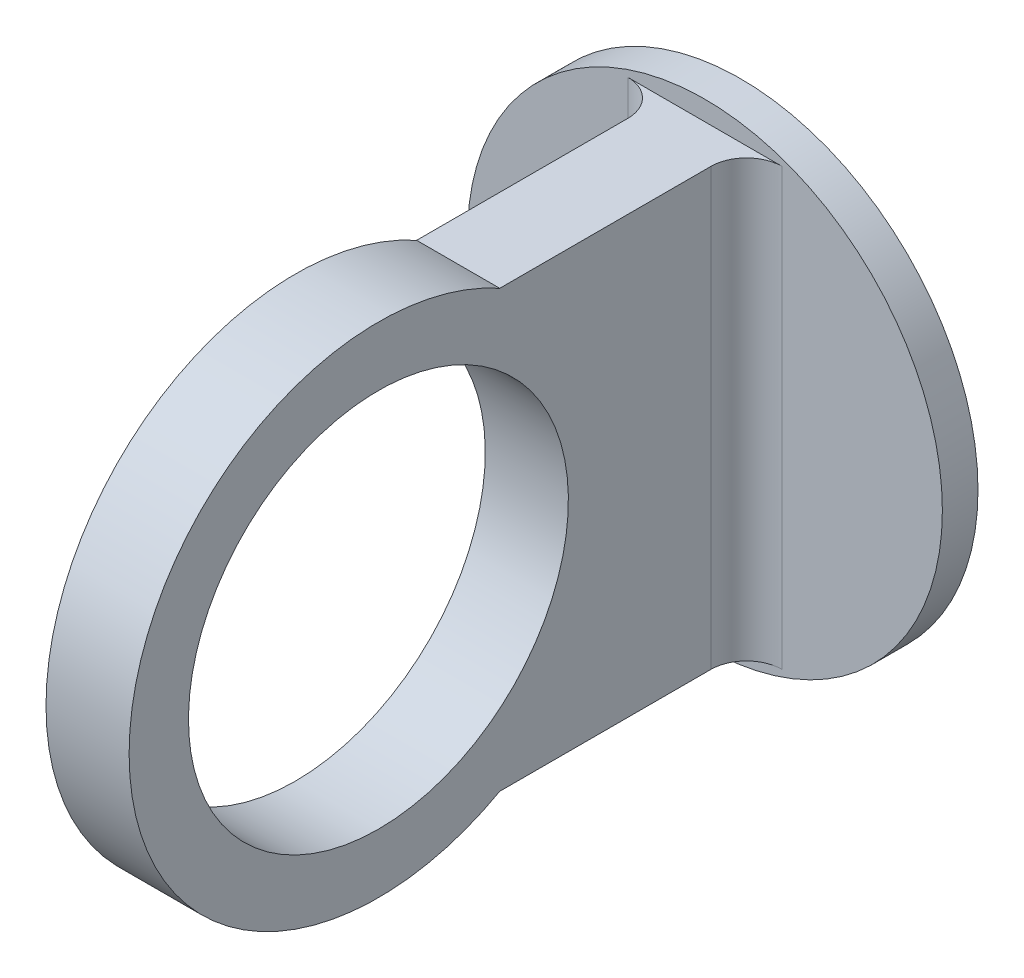
ISO-10303-21;
HEADER;
FILE_DESCRIPTION(('STEP AP214'),'2;1');
FILE_NAME('part.step','',(''),(''),'','','');
FILE_SCHEMA(('AUTOMOTIVE_DESIGN { 1 0 10303 214 1 1 1 1 }'));
ENDSEC;
DATA;
#1=APPLICATION_CONTEXT('core data for automotive mechanical design processes');
#2=APPLICATION_PROTOCOL_DEFINITION('international standard','automotive_design',2000,#1);
#3=PRODUCT_CONTEXT('',#1,'mechanical');
#4=PRODUCT('Part','Part','',(#3));
#5=PRODUCT_RELATED_PRODUCT_CATEGORY('part','',(#4));
#6=PRODUCT_DEFINITION_FORMATION('','',#4);
#7=PRODUCT_DEFINITION_CONTEXT('part definition',#1,'design');
#8=PRODUCT_DEFINITION('design','',#6,#7);
#9=PRODUCT_DEFINITION_SHAPE('','',#8);
#10=(LENGTH_UNIT() NAMED_UNIT(*) SI_UNIT(.MILLI.,.METRE.));
#11=(NAMED_UNIT(*) PLANE_ANGLE_UNIT() SI_UNIT($,.RADIAN.));
#12=(NAMED_UNIT(*) SI_UNIT($,.STERADIAN.) SOLID_ANGLE_UNIT());
#13=UNCERTAINTY_MEASURE_WITH_UNIT(LENGTH_MEASURE(1.E-05),#10,'distance_accuracy_value','');
#14=(GEOMETRIC_REPRESENTATION_CONTEXT(3) GLOBAL_UNCERTAINTY_ASSIGNED_CONTEXT((#13)) GLOBAL_UNIT_ASSIGNED_CONTEXT((#10,
#11,#12)) REPRESENTATION_CONTEXT('',''));
#15=CARTESIAN_POINT('',(0.,0.,0.));
#16=DIRECTION('',(0.,0.,1.));
#17=DIRECTION('',(1.,0.,0.));
#18=AXIS2_PLACEMENT_3D('',#15,#16,#17);
#19=CARTESIAN_POINT('',(0.,0.,3.));
#20=DIRECTION('',(0.,0.,-1.));
#21=DIRECTION('',(-1.,0.,0.));
#22=AXIS2_PLACEMENT_3D('',#19,#20,#21);
#23=CYLINDRICAL_SURFACE('',#22,20.);
#24=CARTESIAN_POINT('',(0.,0.,3.));
#25=DIRECTION('',(0.,0.,1.));
#26=DIRECTION('',(1.,0.,0.));
#27=AXIS2_PLACEMENT_3D('',#24,#25,#26);
#28=CIRCLE('',#27,20.);
#29=CARTESIAN_POINT('',(20.,0.,3.));
#30=VERTEX_POINT('',#29);
#31=EDGE_CURVE('E119',#30,#30,#28,.T.);
#32=ORIENTED_EDGE('',*,*,#31,.F.);
#33=EDGE_LOOP('',(#32));
#34=FACE_BOUND('',#33,.T.);
#35=CARTESIAN_POINT('',(0.,0.,0.));
#36=DIRECTION('',(0.,0.,1.));
#37=DIRECTION('',(1.,0.,0.));
#38=AXIS2_PLACEMENT_3D('',#35,#36,#37);
#39=CIRCLE('',#38,20.);
#40=CARTESIAN_POINT('',(20.,0.,0.));
#41=VERTEX_POINT('',#40);
#42=EDGE_CURVE('E127',#41,#41,#39,.T.);
#43=ORIENTED_EDGE('',*,*,#42,.T.);
#44=EDGE_LOOP('',(#43));
#45=FACE_BOUND('',#44,.T.);
#46=ADVANCED_FACE('F39',(#34,#45),#23,.T.);
#47=CARTESIAN_POINT('',(0.,0.,3.));
#48=DIRECTION('',(0.,0.,1.));
#49=DIRECTION('',(1.,0.,0.));
#50=AXIS2_PLACEMENT_3D('',#47,#48,#49);
#51=PLANE('',#50);
#52=DIRECTION('',(1.,0.,0.));
#53=VECTOR('',#52,1.);
#54=CARTESIAN_POINT('',(0.,-18.3466405357693,3.));
#55=LINE('',#54,#53);
#56=CARTESIAN_POINT('',(-6.5,-18.3466405357693,3.));
#57=VERTEX_POINT('',#56);
#58=CARTESIAN_POINT('',(6.5,-18.3466405357693,3.));
#59=VERTEX_POINT('',#58);
#60=EDGE_CURVE('E144',#57,#59,#55,.T.);
#61=ORIENTED_EDGE('',*,*,#60,.F.);
#62=DIRECTION('',(0.,-1.,0.));
#63=VECTOR('',#62,1.);
#64=CARTESIAN_POINT('',(-6.5,18.3466405357693,3.));
#65=LINE('',#64,#63);
#66=CARTESIAN_POINT('',(-6.5,18.3466405357693,3.));
#67=VERTEX_POINT('',#66);
#68=EDGE_CURVE('E124',#57,#67,#65,.F.);
#69=ORIENTED_EDGE('',*,*,#68,.T.);
#70=DIRECTION('',(-1.,0.,0.));
#71=VECTOR('',#70,1.);
#72=CARTESIAN_POINT('',(0.,18.3466405357693,3.));
#73=LINE('',#72,#71);
#74=CARTESIAN_POINT('',(6.5,18.3466405357693,3.));
#75=VERTEX_POINT('',#74);
#76=EDGE_CURVE('E106',#75,#67,#73,.T.);
#77=ORIENTED_EDGE('',*,*,#76,.F.);
#78=DIRECTION('',(0.,1.,0.));
#79=VECTOR('',#78,1.);
#80=CARTESIAN_POINT('',(6.5,-18.3466405357693,3.));
#81=LINE('',#80,#79);
#82=EDGE_CURVE('E118',#75,#59,#81,.F.);
#83=ORIENTED_EDGE('',*,*,#82,.T.);
#84=EDGE_LOOP('',(#61,#69,#77,#83));
#85=FACE_BOUND('',#84,.T.);
#86=ORIENTED_EDGE('',*,*,#31,.T.);
#87=EDGE_LOOP('',(#86));
#88=FACE_BOUND('',#87,.T.);
#89=ADVANCED_FACE('F173',(#85,#88),#51,.T.);
#90=CARTESIAN_POINT('',(0.,0.,0.));
#91=DIRECTION('',(0.,0.,1.));
#92=DIRECTION('',(1.,0.,0.));
#93=AXIS2_PLACEMENT_3D('',#90,#91,#92);
#94=PLANE('',#93);
#95=ORIENTED_EDGE('',*,*,#42,.F.);
#96=EDGE_LOOP('',(#95));
#97=FACE_BOUND('',#96,.T.);
#98=ADVANCED_FACE('F171',(#97),#94,.F.);
#99=CARTESIAN_POINT('',(-3.5,18.3466405357693,30.));
#100=DIRECTION('',(-1.,0.,0.));
#101=DIRECTION('',(0.,-1.,0.));
#102=AXIS2_PLACEMENT_3D('',#99,#100,#101);
#103=PLANE('',#102);
#104=CARTESIAN_POINT('',(-3.5,0.,34.));
#105=DIRECTION('',(-1.,0.,0.));
#106=DIRECTION('',(0.,-1.,0.));
#107=AXIS2_PLACEMENT_3D('',#104,#105,#106);
#108=CIRCLE('',#107,16.);
#109=CARTESIAN_POINT('',(-3.5,-16.,34.));
#110=VERTEX_POINT('',#109);
#111=EDGE_CURVE('E215',#110,#110,#108,.T.);
#112=ORIENTED_EDGE('',*,*,#111,.F.);
#113=EDGE_LOOP('',(#112));
#114=FACE_BOUND('',#113,.T.);
#115=DIRECTION('',(0.,0.,-1.));
#116=VECTOR('',#115,1.);
#117=CARTESIAN_POINT('',(-3.5,-18.3466405357693,30.));
#118=LINE('',#117,#116);
#119=CARTESIAN_POINT('',(-3.5,-18.3466405357693,23.7823299597577));
#120=VERTEX_POINT('',#119);
#121=CARTESIAN_POINT('',(-3.5,-18.3466405357693,6.));
#122=VERTEX_POINT('',#121);
#123=EDGE_CURVE('E155',#120,#122,#118,.T.);
#124=ORIENTED_EDGE('',*,*,#123,.F.);
#125=CARTESIAN_POINT('',(-3.5,0.,34.));
#126=DIRECTION('',(-1.,0.,0.));
#127=DIRECTION('',(0.,-1.,0.));
#128=AXIS2_PLACEMENT_3D('',#125,#126,#127);
#129=CIRCLE('',#128,21.);
#130=CARTESIAN_POINT('',(-3.5,18.3466405357693,23.7823299597577));
#131=VERTEX_POINT('',#130);
#132=EDGE_CURVE('E97',#120,#131,#129,.T.);
#133=ORIENTED_EDGE('',*,*,#132,.T.);
#134=DIRECTION('',(0.,0.,-1.));
#135=VECTOR('',#134,1.);
#136=CARTESIAN_POINT('',(-3.5,18.3466405357693,30.));
#137=LINE('',#136,#135);
#138=CARTESIAN_POINT('',(-3.5,18.3466405357693,6.));
#139=VERTEX_POINT('',#138);
#140=EDGE_CURVE('E91',#131,#139,#137,.T.);
#141=ORIENTED_EDGE('',*,*,#140,.T.);
#142=DIRECTION('',(0.,-1.,0.));
#143=VECTOR('',#142,1.);
#144=CARTESIAN_POINT('',(-3.5,-18.3466405357693,6.));
#145=LINE('',#144,#143);
#146=EDGE_CURVE('E95',#139,#122,#145,.T.);
#147=ORIENTED_EDGE('',*,*,#146,.T.);
#148=EDGE_LOOP('',(#124,#133,#141,#147));
#149=FACE_BOUND('',#148,.T.);
#150=ADVANCED_FACE('F93',(#114,#149),#103,.T.);
#151=CARTESIAN_POINT('',(3.5,-18.3466405357693,30.));
#152=DIRECTION('',(0.,-1.,0.));
#153=DIRECTION('',(0.,0.,-1.));
#154=AXIS2_PLACEMENT_3D('',#151,#152,#153);
#155=PLANE('',#154);
#156=DIRECTION('',(-1.,0.,0.));
#157=VECTOR('',#156,1.);
#158=CARTESIAN_POINT('',(3.5,-18.3466405357693,23.7823299597577));
#159=LINE('',#158,#157);
#160=CARTESIAN_POINT('',(3.5,-18.3466405357693,23.7823299597577));
#161=VERTEX_POINT('',#160);
#162=EDGE_CURVE('E55',#120,#161,#159,.F.);
#163=ORIENTED_EDGE('',*,*,#162,.F.);
#164=ORIENTED_EDGE('',*,*,#123,.T.);
#165=CARTESIAN_POINT('',(-6.5,-18.3466405357693,6.));
#166=DIRECTION('',(0.,-1.,0.));
#167=DIRECTION('',(0.,0.,-1.));
#168=AXIS2_PLACEMENT_3D('',#165,#166,#167);
#169=CIRCLE('',#168,3.);
#170=EDGE_CURVE('E112',#122,#57,#169,.F.);
#171=ORIENTED_EDGE('',*,*,#170,.T.);
#172=ORIENTED_EDGE('',*,*,#60,.T.);
#173=CARTESIAN_POINT('',(6.5,-18.3466405357693,6.));
#174=DIRECTION('',(0.,-1.,0.));
#175=DIRECTION('',(0.,0.,-1.));
#176=AXIS2_PLACEMENT_3D('',#173,#174,#175);
#177=CIRCLE('',#176,3.);
#178=CARTESIAN_POINT('',(3.5,-18.3466405357693,6.));
#179=VERTEX_POINT('',#178);
#180=EDGE_CURVE('E48',#59,#179,#177,.F.);
#181=ORIENTED_EDGE('',*,*,#180,.T.);
#182=DIRECTION('',(0.,0.,-1.));
#183=VECTOR('',#182,1.);
#184=CARTESIAN_POINT('',(3.5,-18.3466405357693,30.));
#185=LINE('',#184,#183);
#186=EDGE_CURVE('E60',#161,#179,#185,.T.);
#187=ORIENTED_EDGE('',*,*,#186,.F.);
#188=EDGE_LOOP('',(#163,#164,#171,#172,#181,#187));
#189=FACE_BOUND('',#188,.T.);
#190=ADVANCED_FACE('F143',(#189),#155,.T.);
#191=CARTESIAN_POINT('',(3.5,18.3466405357693,30.));
#192=DIRECTION('',(1.,0.,0.));
#193=DIRECTION('',(0.,1.,0.));
#194=AXIS2_PLACEMENT_3D('',#191,#192,#193);
#195=PLANE('',#194);
#196=CARTESIAN_POINT('',(3.5,0.,34.));
#197=DIRECTION('',(-1.,0.,0.));
#198=DIRECTION('',(0.,-1.,0.));
#199=AXIS2_PLACEMENT_3D('',#196,#197,#198);
#200=CIRCLE('',#199,16.);
#201=CARTESIAN_POINT('',(3.5,-16.,34.));
#202=VERTEX_POINT('',#201);
#203=EDGE_CURVE('E218',#202,#202,#200,.T.);
#204=ORIENTED_EDGE('',*,*,#203,.T.);
#205=EDGE_LOOP('',(#204));
#206=FACE_BOUND('',#205,.T.);
#207=CARTESIAN_POINT('',(3.5,0.,34.));
#208=DIRECTION('',(-1.,0.,0.));
#209=DIRECTION('',(0.,-1.,0.));
#210=AXIS2_PLACEMENT_3D('',#207,#208,#209);
#211=CIRCLE('',#210,21.);
#212=CARTESIAN_POINT('',(3.5,18.3466405357693,23.7823299597577));
#213=VERTEX_POINT('',#212);
#214=EDGE_CURVE('E153',#161,#213,#211,.T.);
#215=ORIENTED_EDGE('',*,*,#214,.F.);
#216=ORIENTED_EDGE('',*,*,#186,.T.);
#217=DIRECTION('',(0.,1.,0.));
#218=VECTOR('',#217,1.);
#219=CARTESIAN_POINT('',(3.5,18.3466405357693,6.));
#220=LINE('',#219,#218);
#221=CARTESIAN_POINT('',(3.5,18.3466405357693,6.));
#222=VERTEX_POINT('',#221);
#223=EDGE_CURVE('E133',#179,#222,#220,.T.);
#224=ORIENTED_EDGE('',*,*,#223,.T.);
#225=DIRECTION('',(0.,0.,-1.));
#226=VECTOR('',#225,1.);
#227=CARTESIAN_POINT('',(3.5,18.3466405357693,30.));
#228=LINE('',#227,#226);
#229=EDGE_CURVE('E100',#213,#222,#228,.T.);
#230=ORIENTED_EDGE('',*,*,#229,.F.);
#231=EDGE_LOOP('',(#215,#216,#224,#230));
#232=FACE_BOUND('',#231,.T.);
#233=ADVANCED_FACE('F151',(#206,#232),#195,.T.);
#234=CARTESIAN_POINT('',(3.5,18.3466405357693,30.));
#235=DIRECTION('',(0.,1.,0.));
#236=DIRECTION('',(0.,0.,1.));
#237=AXIS2_PLACEMENT_3D('',#234,#235,#236);
#238=PLANE('',#237);
#239=DIRECTION('',(-1.,0.,0.));
#240=VECTOR('',#239,1.);
#241=CARTESIAN_POINT('',(3.5,18.3466405357693,23.7823299597577));
#242=LINE('',#241,#240);
#243=EDGE_CURVE('E11',#213,#131,#242,.T.);
#244=ORIENTED_EDGE('',*,*,#243,.F.);
#245=ORIENTED_EDGE('',*,*,#229,.T.);
#246=CARTESIAN_POINT('',(6.5,18.3466405357693,6.));
#247=DIRECTION('',(0.,1.,0.));
#248=DIRECTION('',(0.,0.,1.));
#249=AXIS2_PLACEMENT_3D('',#246,#247,#248);
#250=CIRCLE('',#249,3.);
#251=EDGE_CURVE('E111',#222,#75,#250,.F.);
#252=ORIENTED_EDGE('',*,*,#251,.T.);
#253=ORIENTED_EDGE('',*,*,#76,.T.);
#254=CARTESIAN_POINT('',(-6.5,18.3466405357693,6.));
#255=DIRECTION('',(0.,1.,0.));
#256=DIRECTION('',(0.,0.,1.));
#257=AXIS2_PLACEMENT_3D('',#254,#255,#256);
#258=CIRCLE('',#257,3.);
#259=EDGE_CURVE('E103',#67,#139,#258,.F.);
#260=ORIENTED_EDGE('',*,*,#259,.T.);
#261=ORIENTED_EDGE('',*,*,#140,.F.);
#262=EDGE_LOOP('',(#244,#245,#252,#253,#260,#261));
#263=FACE_BOUND('',#262,.T.);
#264=ADVANCED_FACE('F104',(#263),#238,.T.);
#265=CARTESIAN_POINT('',(-6.5,18.3466405357693,6.));
#266=DIRECTION('',(0.,1.,0.));
#267=DIRECTION('',(-1.,0.,0.));
#268=AXIS2_PLACEMENT_3D('',#265,#266,#267);
#269=CYLINDRICAL_SURFACE('',#268,3.);
#270=ORIENTED_EDGE('',*,*,#259,.F.);
#271=ORIENTED_EDGE('',*,*,#68,.F.);
#272=ORIENTED_EDGE('',*,*,#170,.F.);
#273=ORIENTED_EDGE('',*,*,#146,.F.);
#274=EDGE_LOOP('',(#270,#271,#272,#273));
#275=FACE_BOUND('',#274,.T.);
#276=ADVANCED_FACE('F115',(#275),#269,.F.);
#277=CARTESIAN_POINT('',(6.5,18.3466405357693,6.));
#278=DIRECTION('',(0.,-1.,0.));
#279=DIRECTION('',(1.,0.,0.));
#280=AXIS2_PLACEMENT_3D('',#277,#278,#279);
#281=CYLINDRICAL_SURFACE('',#280,3.);
#282=ORIENTED_EDGE('',*,*,#180,.F.);
#283=ORIENTED_EDGE('',*,*,#82,.F.);
#284=ORIENTED_EDGE('',*,*,#251,.F.);
#285=ORIENTED_EDGE('',*,*,#223,.F.);
#286=EDGE_LOOP('',(#282,#283,#284,#285));
#287=FACE_BOUND('',#286,.T.);
#288=ADVANCED_FACE('F41',(#287),#281,.F.);
#289=CARTESIAN_POINT('',(3.5,0.,34.));
#290=DIRECTION('',(-1.,0.,0.));
#291=DIRECTION('',(0.,-1.,0.));
#292=AXIS2_PLACEMENT_3D('',#289,#290,#291);
#293=CYLINDRICAL_SURFACE('',#292,16.);
#294=ORIENTED_EDGE('',*,*,#111,.T.);
#295=EDGE_LOOP('',(#294));
#296=FACE_BOUND('',#295,.T.);
#297=ORIENTED_EDGE('',*,*,#203,.F.);
#298=EDGE_LOOP('',(#297));
#299=FACE_BOUND('',#298,.T.);
#300=ADVANCED_FACE('F194',(#296,#299),#293,.F.);
#301=CARTESIAN_POINT('',(3.5,0.,34.));
#302=DIRECTION('',(-1.,0.,0.));
#303=DIRECTION('',(0.,-1.,0.));
#304=AXIS2_PLACEMENT_3D('',#301,#302,#303);
#305=CYLINDRICAL_SURFACE('',#304,21.);
#306=ORIENTED_EDGE('',*,*,#132,.F.);
#307=ORIENTED_EDGE('',*,*,#162,.T.);
#308=ORIENTED_EDGE('',*,*,#214,.T.);
#309=ORIENTED_EDGE('',*,*,#243,.T.);
#310=EDGE_LOOP('',(#306,#307,#308,#309));
#311=FACE_BOUND('',#310,.T.);
#312=ADVANCED_FACE('F204',(#311),#305,.T.);
#313=CLOSED_SHELL('',(#46,#89,#98,#150,#190,#233,#264,#276,#288,#300,#312));
#314=MANIFOLD_SOLID_BREP('B2',#313);
#315=ADVANCED_BREP_SHAPE_REPRESENTATION('',(#18,#314),#14);
#316=SHAPE_DEFINITION_REPRESENTATION(#9,#315);
ENDSEC;
END-ISO-10303-21;
